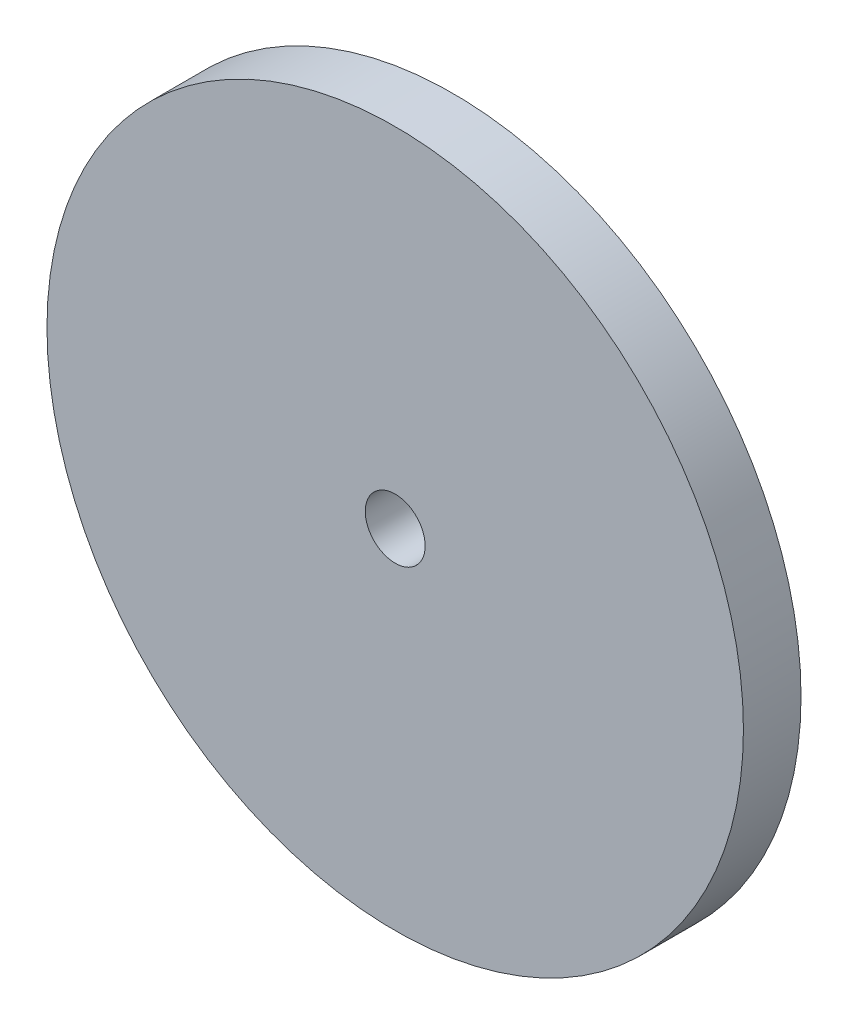
ISO-10303-21;
HEADER;
FILE_DESCRIPTION(('STEP AP214'),'2;1');
FILE_NAME('part.step','',(''),(''),'','','');
FILE_SCHEMA(('AUTOMOTIVE_DESIGN { 1 0 10303 214 1 1 1 1 }'));
ENDSEC;
DATA;
#1=APPLICATION_CONTEXT('core data for automotive mechanical design processes');
#2=APPLICATION_PROTOCOL_DEFINITION('international standard','automotive_design',2000,#1);
#3=PRODUCT_CONTEXT('',#1,'mechanical');
#4=PRODUCT('Part','Part','',(#3));
#5=PRODUCT_RELATED_PRODUCT_CATEGORY('part','',(#4));
#6=PRODUCT_DEFINITION_FORMATION('','',#4);
#7=PRODUCT_DEFINITION_CONTEXT('part definition',#1,'design');
#8=PRODUCT_DEFINITION('design','',#6,#7);
#9=PRODUCT_DEFINITION_SHAPE('','',#8);
#10=(LENGTH_UNIT() NAMED_UNIT(*) SI_UNIT(.MILLI.,.METRE.));
#11=(NAMED_UNIT(*) PLANE_ANGLE_UNIT() SI_UNIT($,.RADIAN.));
#12=(NAMED_UNIT(*) SI_UNIT($,.STERADIAN.) SOLID_ANGLE_UNIT());
#13=UNCERTAINTY_MEASURE_WITH_UNIT(LENGTH_MEASURE(1.E-05),#10,'distance_accuracy_value','');
#14=(GEOMETRIC_REPRESENTATION_CONTEXT(3) GLOBAL_UNCERTAINTY_ASSIGNED_CONTEXT((#13)) GLOBAL_UNIT_ASSIGNED_CONTEXT((#10,
#11,#12)) REPRESENTATION_CONTEXT('',''));
#15=CARTESIAN_POINT('',(0.,0.,0.));
#16=DIRECTION('',(0.,0.,1.));
#17=DIRECTION('',(1.,0.,0.));
#18=AXIS2_PLACEMENT_3D('',#15,#16,#17);
#19=CARTESIAN_POINT('',(0.,0.,3.175));
#20=DIRECTION('',(0.,0.,1.));
#21=DIRECTION('',(1.,0.,0.));
#22=AXIS2_PLACEMENT_3D('',#19,#20,#21);
#23=PLANE('',#22);
#24=CARTESIAN_POINT('',(0.,0.,3.175));
#25=DIRECTION('',(0.,0.,1.));
#26=DIRECTION('',(1.,0.,0.));
#27=AXIS2_PLACEMENT_3D('',#24,#25,#26);
#28=CIRCLE('',#27,1.651);
#29=CARTESIAN_POINT('',(1.651,0.,3.175));
#30=VERTEX_POINT('',#29);
#31=EDGE_CURVE('E48',#30,#30,#28,.T.);
#32=ORIENTED_EDGE('',*,*,#31,.F.);
#33=EDGE_LOOP('',(#32));
#34=FACE_BOUND('',#33,.T.);
#35=CARTESIAN_POINT('',(0.,0.,3.175));
#36=DIRECTION('',(0.,0.,1.));
#37=DIRECTION('',(1.,0.,0.));
#38=AXIS2_PLACEMENT_3D('',#35,#36,#37);
#39=CIRCLE('',#38,19.2);
#40=CARTESIAN_POINT('',(19.2,0.,3.175));
#41=VERTEX_POINT('',#40);
#42=EDGE_CURVE('E10',#41,#41,#39,.T.);
#43=ORIENTED_EDGE('',*,*,#42,.T.);
#44=EDGE_LOOP('',(#43));
#45=FACE_BOUND('',#44,.T.);
#46=ADVANCED_FACE('F37',(#34,#45),#23,.T.);
#47=CARTESIAN_POINT('',(0.,0.,0.));
#48=DIRECTION('',(0.,0.,1.));
#49=DIRECTION('',(1.,0.,0.));
#50=AXIS2_PLACEMENT_3D('',#47,#48,#49);
#51=PLANE('',#50);
#52=CARTESIAN_POINT('',(0.,0.,0.));
#53=DIRECTION('',(0.,0.,1.));
#54=DIRECTION('',(1.,0.,0.));
#55=AXIS2_PLACEMENT_3D('',#52,#53,#54);
#56=CIRCLE('',#55,19.2);
#57=CARTESIAN_POINT('',(19.2,0.,0.));
#58=VERTEX_POINT('',#57);
#59=EDGE_CURVE('E41',#58,#58,#56,.T.);
#60=ORIENTED_EDGE('',*,*,#59,.F.);
#61=EDGE_LOOP('',(#60));
#62=FACE_BOUND('',#61,.T.);
#63=CARTESIAN_POINT('',(0.,0.,0.));
#64=DIRECTION('',(0.,0.,1.));
#65=DIRECTION('',(1.,0.,0.));
#66=AXIS2_PLACEMENT_3D('',#63,#64,#65);
#67=CIRCLE('',#66,1.651);
#68=CARTESIAN_POINT('',(1.651,0.,0.));
#69=VERTEX_POINT('',#68);
#70=EDGE_CURVE('E50',#69,#69,#67,.T.);
#71=ORIENTED_EDGE('',*,*,#70,.T.);
#72=EDGE_LOOP('',(#71));
#73=FACE_BOUND('',#72,.T.);
#74=ADVANCED_FACE('F60',(#62,#73),#51,.F.);
#75=CARTESIAN_POINT('',(0.,0.,3.175));
#76=DIRECTION('',(0.,0.,-1.));
#77=DIRECTION('',(-1.,0.,0.));
#78=AXIS2_PLACEMENT_3D('',#75,#76,#77);
#79=CYLINDRICAL_SURFACE('',#78,19.2);
#80=ORIENTED_EDGE('',*,*,#42,.F.);
#81=EDGE_LOOP('',(#80));
#82=FACE_BOUND('',#81,.T.);
#83=ORIENTED_EDGE('',*,*,#59,.T.);
#84=EDGE_LOOP('',(#83));
#85=FACE_BOUND('',#84,.T.);
#86=ADVANCED_FACE('F39',(#82,#85),#79,.T.);
#87=CARTESIAN_POINT('',(0.,0.,3.175));
#88=DIRECTION('',(0.,0.,-1.));
#89=DIRECTION('',(-1.,0.,0.));
#90=AXIS2_PLACEMENT_3D('',#87,#88,#89);
#91=CYLINDRICAL_SURFACE('',#90,1.651);
#92=ORIENTED_EDGE('',*,*,#31,.T.);
#93=EDGE_LOOP('',(#92));
#94=FACE_BOUND('',#93,.T.);
#95=ORIENTED_EDGE('',*,*,#70,.F.);
#96=EDGE_LOOP('',(#95));
#97=FACE_BOUND('',#96,.T.);
#98=ADVANCED_FACE('F56',(#94,#97),#91,.F.);
#99=CLOSED_SHELL('',(#46,#74,#86,#98));
#100=MANIFOLD_SOLID_BREP('B2',#99);
#101=ADVANCED_BREP_SHAPE_REPRESENTATION('',(#18,#100),#14);
#102=SHAPE_DEFINITION_REPRESENTATION(#9,#101);
ENDSEC;
END-ISO-10303-21;
